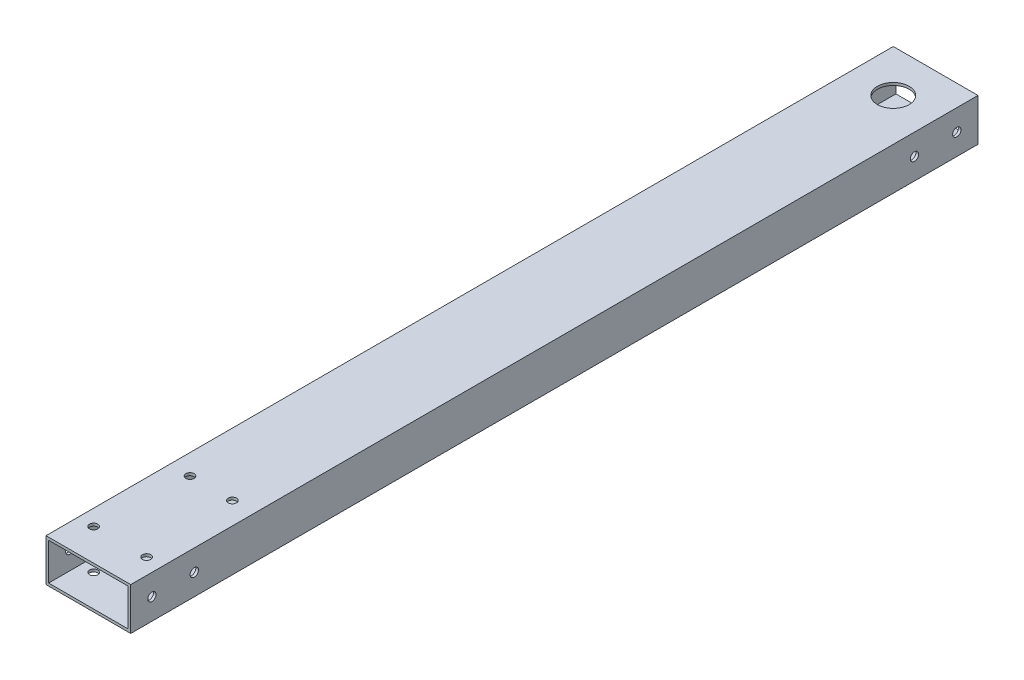
ISO-10303-21;
HEADER;
FILE_DESCRIPTION(('STEP AP214'),'2;1');
FILE_NAME('part.step','',(''),(''),'','','');
FILE_SCHEMA(('AUTOMOTIVE_DESIGN { 1 0 10303 214 1 1 1 1 }'));
ENDSEC;
DATA;
#1=APPLICATION_CONTEXT('core data for automotive mechanical design processes');
#2=APPLICATION_PROTOCOL_DEFINITION('international standard','automotive_design',2000,#1);
#3=PRODUCT_CONTEXT('',#1,'mechanical');
#4=PRODUCT('Part','Part','',(#3));
#5=PRODUCT_RELATED_PRODUCT_CATEGORY('part','',(#4));
#6=PRODUCT_DEFINITION_FORMATION('','',#4);
#7=PRODUCT_DEFINITION_CONTEXT('part definition',#1,'design');
#8=PRODUCT_DEFINITION('design','',#6,#7);
#9=PRODUCT_DEFINITION_SHAPE('','',#8);
#10=(LENGTH_UNIT() NAMED_UNIT(*) SI_UNIT(.MILLI.,.METRE.));
#11=(NAMED_UNIT(*) PLANE_ANGLE_UNIT() SI_UNIT($,.RADIAN.));
#12=(NAMED_UNIT(*) SI_UNIT($,.STERADIAN.) SOLID_ANGLE_UNIT());
#13=UNCERTAINTY_MEASURE_WITH_UNIT(LENGTH_MEASURE(1.E-05),#10,'distance_accuracy_value','');
#14=(GEOMETRIC_REPRESENTATION_CONTEXT(3) GLOBAL_UNCERTAINTY_ASSIGNED_CONTEXT((#13)) GLOBAL_UNIT_ASSIGNED_CONTEXT((#10,
#11,#12)) REPRESENTATION_CONTEXT('',''));
#15=CARTESIAN_POINT('',(0.,0.,0.));
#16=DIRECTION('',(0.,0.,1.));
#17=DIRECTION('',(1.,0.,0.));
#18=AXIS2_PLACEMENT_3D('',#15,#16,#17);
#19=CARTESIAN_POINT('',(0.,0.,254.000000508));
#20=DIRECTION('',(0.,0.,1.));
#21=DIRECTION('',(1.,0.,0.));
#22=AXIS2_PLACEMENT_3D('',#19,#20,#21);
#23=PLANE('',#22);
#24=DIRECTION('',(0.,-1.,0.));
#25=VECTOR('',#24,1.);
#26=CARTESIAN_POINT('',(-25.4,12.7,254.000000508));
#27=LINE('',#26,#25);
#28=CARTESIAN_POINT('',(-25.4,12.7,254.000000508));
#29=VERTEX_POINT('',#28);
#30=CARTESIAN_POINT('',(-25.4,-12.7,254.000000508));
#31=VERTEX_POINT('',#30);
#32=EDGE_CURVE('E123',#29,#31,#27,.T.);
#33=ORIENTED_EDGE('',*,*,#32,.T.);
#34=DIRECTION('',(1.,0.,0.));
#35=VECTOR('',#34,1.);
#36=CARTESIAN_POINT('',(-25.4,-12.7,254.000000508));
#37=LINE('',#36,#35);
#38=CARTESIAN_POINT('',(25.4,-12.7,254.000000508));
#39=VERTEX_POINT('',#38);
#40=EDGE_CURVE('E188',#31,#39,#37,.T.);
#41=ORIENTED_EDGE('',*,*,#40,.T.);
#42=DIRECTION('',(0.,1.,0.));
#43=VECTOR('',#42,1.);
#44=CARTESIAN_POINT('',(25.4,-12.7,254.000000508));
#45=LINE('',#44,#43);
#46=CARTESIAN_POINT('',(25.4,12.7,254.000000508));
#47=VERTEX_POINT('',#46);
#48=EDGE_CURVE('E191',#39,#47,#45,.T.);
#49=ORIENTED_EDGE('',*,*,#48,.T.);
#50=DIRECTION('',(-1.,0.,0.));
#51=VECTOR('',#50,1.);
#52=CARTESIAN_POINT('',(25.4,12.7,254.000000508));
#53=LINE('',#52,#51);
#54=EDGE_CURVE('E69',#47,#29,#53,.T.);
#55=ORIENTED_EDGE('',*,*,#54,.T.);
#56=EDGE_LOOP('',(#33,#41,#49,#55));
#57=FACE_BOUND('',#56,.T.);
#58=DIRECTION('',(1.,0.,0.));
#59=VECTOR('',#58,1.);
#60=CARTESIAN_POINT('',(-23.8125,-11.1125,254.000000508));
#61=LINE('',#60,#59);
#62=CARTESIAN_POINT('',(-23.8125,-11.1125,254.000000508));
#63=VERTEX_POINT('',#62);
#64=CARTESIAN_POINT('',(23.8125,-11.1125,254.000000508));
#65=VERTEX_POINT('',#64);
#66=EDGE_CURVE('E170',#63,#65,#61,.T.);
#67=ORIENTED_EDGE('',*,*,#66,.F.);
#68=DIRECTION('',(0.,-1.,0.));
#69=VECTOR('',#68,1.);
#70=CARTESIAN_POINT('',(-23.8125,11.1125,254.000000508));
#71=LINE('',#70,#69);
#72=CARTESIAN_POINT('',(-23.8125,11.1125,254.000000508));
#73=VERTEX_POINT('',#72);
#74=EDGE_CURVE('E119',#73,#63,#71,.T.);
#75=ORIENTED_EDGE('',*,*,#74,.F.);
#76=DIRECTION('',(-1.,0.,0.));
#77=VECTOR('',#76,1.);
#78=CARTESIAN_POINT('',(23.8125,11.1125,254.000000508));
#79=LINE('',#78,#77);
#80=CARTESIAN_POINT('',(23.8125,11.1125,254.000000508));
#81=VERTEX_POINT('',#80);
#82=EDGE_CURVE('E176',#81,#73,#79,.T.);
#83=ORIENTED_EDGE('',*,*,#82,.F.);
#84=DIRECTION('',(0.,1.,0.));
#85=VECTOR('',#84,1.);
#86=CARTESIAN_POINT('',(23.8125,-11.1125,254.000000508));
#87=LINE('',#86,#85);
#88=EDGE_CURVE('E173',#65,#81,#87,.T.);
#89=ORIENTED_EDGE('',*,*,#88,.F.);
#90=EDGE_LOOP('',(#67,#75,#83,#89));
#91=FACE_BOUND('',#90,.T.);
#92=ADVANCED_FACE('F43',(#57,#91),#23,.T.);
#93=CARTESIAN_POINT('',(-25.4,12.7,254.000000508));
#94=DIRECTION('',(1.,0.,0.));
#95=DIRECTION('',(0.,0.,-1.));
#96=AXIS2_PLACEMENT_3D('',#93,#94,#95);
#97=PLANE('',#96);
#98=CARTESIAN_POINT('',(-25.4,1.33226762955019E-12,241.300000508));
#99=DIRECTION('',(1.,0.,0.));
#100=DIRECTION('',(0.,0.,-1.));
#101=AXIS2_PLACEMENT_3D('',#98,#99,#100);
#102=CIRCLE('',#101,2.48919999999999);
#103=CARTESIAN_POINT('',(-25.4,1.33226762955019E-12,238.810800508));
#104=VERTEX_POINT('',#103);
#105=EDGE_CURVE('E287',#104,#104,#102,.T.);
#106=ORIENTED_EDGE('',*,*,#105,.T.);
#107=EDGE_LOOP('',(#106));
#108=FACE_BOUND('',#107,.T.);
#109=CARTESIAN_POINT('',(-25.4,1.33226762955019E-12,215.900000508));
#110=DIRECTION('',(1.,0.,0.));
#111=DIRECTION('',(0.,0.,-1.));
#112=AXIS2_PLACEMENT_3D('',#109,#110,#111);
#113=CIRCLE('',#112,2.48919999999999);
#114=CARTESIAN_POINT('',(-25.4,1.33226762955019E-12,213.410800508));
#115=VERTEX_POINT('',#114);
#116=EDGE_CURVE('E303',#115,#115,#113,.T.);
#117=ORIENTED_EDGE('',*,*,#116,.T.);
#118=EDGE_LOOP('',(#117));
#119=FACE_BOUND('',#118,.T.);
#120=CARTESIAN_POINT('',(-25.4,1.11022302462516E-13,-215.899999492001));
#121=DIRECTION('',(1.,0.,0.));
#122=DIRECTION('',(0.,0.,-1.));
#123=AXIS2_PLACEMENT_3D('',#120,#121,#122);
#124=CIRCLE('',#123,2.48919999999999);
#125=CARTESIAN_POINT('',(-25.4,1.11022302462516E-13,-218.389199492001));
#126=VERTEX_POINT('',#125);
#127=EDGE_CURVE('E213',#126,#126,#124,.T.);
#128=ORIENTED_EDGE('',*,*,#127,.T.);
#129=EDGE_LOOP('',(#128));
#130=FACE_BOUND('',#129,.T.);
#131=CARTESIAN_POINT('',(-25.4,1.11022302462516E-13,-241.299999492001));
#132=DIRECTION('',(1.,0.,0.));
#133=DIRECTION('',(0.,0.,-1.));
#134=AXIS2_PLACEMENT_3D('',#131,#132,#133);
#135=CIRCLE('',#134,2.48919999999999);
#136=CARTESIAN_POINT('',(-25.4,1.11022302462516E-13,-243.789199492001));
#137=VERTEX_POINT('',#136);
#138=EDGE_CURVE('E207',#137,#137,#135,.T.);
#139=ORIENTED_EDGE('',*,*,#138,.T.);
#140=EDGE_LOOP('',(#139));
#141=FACE_BOUND('',#140,.T.);
#142=DIRECTION('',(0.,0.,-1.));
#143=VECTOR('',#142,1.);
#144=CARTESIAN_POINT('',(-25.4,12.7,254.000000508));
#145=LINE('',#144,#143);
#146=CARTESIAN_POINT('',(-25.4,12.7,-254.000000508));
#147=VERTEX_POINT('',#146);
#148=EDGE_CURVE('E196',#29,#147,#145,.T.);
#149=ORIENTED_EDGE('',*,*,#148,.T.);
#150=DIRECTION('',(0.,-1.,0.));
#151=VECTOR('',#150,1.);
#152=CARTESIAN_POINT('',(-25.4,12.7,-254.000000508));
#153=LINE('',#152,#151);
#154=CARTESIAN_POINT('',(-25.4,-12.7,-254.000000508));
#155=VERTEX_POINT('',#154);
#156=EDGE_CURVE('E152',#147,#155,#153,.T.);
#157=ORIENTED_EDGE('',*,*,#156,.T.);
#158=DIRECTION('',(0.,0.,-1.));
#159=VECTOR('',#158,1.);
#160=CARTESIAN_POINT('',(-25.4,-12.7,254.000000508));
#161=LINE('',#160,#159);
#162=EDGE_CURVE('E11',#31,#155,#161,.T.);
#163=ORIENTED_EDGE('',*,*,#162,.F.);
#164=ORIENTED_EDGE('',*,*,#32,.F.);
#165=EDGE_LOOP('',(#149,#157,#163,#164));
#166=FACE_BOUND('',#165,.T.);
#167=ADVANCED_FACE('F45',(#108,#119,#130,#141,#166),#97,.F.);
#168=CARTESIAN_POINT('',(-25.4,-12.7,254.000000508));
#169=DIRECTION('',(0.,1.,0.));
#170=DIRECTION('',(-1.,0.,0.));
#171=AXIS2_PLACEMENT_3D('',#168,#169,#170);
#172=PLANE('',#171);
#173=CARTESIAN_POINT('',(0.,-12.7,-228.600000508));
#174=DIRECTION('',(0.,1.,0.));
#175=DIRECTION('',(-1.,0.,0.));
#176=AXIS2_PLACEMENT_3D('',#173,#174,#175);
#177=CIRCLE('',#176,9.525);
#178=CARTESIAN_POINT('',(-9.52499999999999,-12.7,-228.600000508));
#179=VERTEX_POINT('',#178);
#180=EDGE_CURVE('E372',#179,#179,#177,.T.);
#181=ORIENTED_EDGE('',*,*,#180,.T.);
#182=EDGE_LOOP('',(#181));
#183=FACE_BOUND('',#182,.T.);
#184=CARTESIAN_POINT('',(-13.2079999089587,-12.7,179.867533038203));
#185=DIRECTION('',(0.,1.,0.));
#186=DIRECTION('',(0.,0.,1.));
#187=AXIS2_PLACEMENT_3D('',#184,#185,#186);
#188=CIRCLE('',#187,2.48919999999999);
#189=CARTESIAN_POINT('',(-13.2079999089587,-12.7,182.356733038203));
#190=VERTEX_POINT('',#189);
#191=EDGE_CURVE('E229',#190,#190,#188,.T.);
#192=ORIENTED_EDGE('',*,*,#191,.T.);
#193=EDGE_LOOP('',(#192));
#194=FACE_BOUND('',#193,.T.);
#195=CARTESIAN_POINT('',(12.1920000910412,-12.7,179.867533038203));
#196=DIRECTION('',(0.,1.,0.));
#197=DIRECTION('',(0.,0.,1.));
#198=AXIS2_PLACEMENT_3D('',#195,#196,#197);
#199=CIRCLE('',#198,2.48919999999999);
#200=CARTESIAN_POINT('',(12.1920000910412,-12.7,182.356733038203));
#201=VERTEX_POINT('',#200);
#202=EDGE_CURVE('E224',#201,#201,#199,.T.);
#203=ORIENTED_EDGE('',*,*,#202,.T.);
#204=EDGE_LOOP('',(#203));
#205=FACE_BOUND('',#204,.T.);
#206=CARTESIAN_POINT('',(-15.875,-12.7,234.950000508));
#207=DIRECTION('',(0.,1.,0.));
#208=DIRECTION('',(0.,0.,1.));
#209=AXIS2_PLACEMENT_3D('',#206,#207,#208);
#210=CIRCLE('',#209,2.48919999999999);
#211=CARTESIAN_POINT('',(-15.875,-12.7,237.439200508));
#212=VERTEX_POINT('',#211);
#213=EDGE_CURVE('E219',#212,#212,#210,.T.);
#214=ORIENTED_EDGE('',*,*,#213,.T.);
#215=EDGE_LOOP('',(#214));
#216=FACE_BOUND('',#215,.T.);
#217=CARTESIAN_POINT('',(15.875,-12.7,234.950000508));
#218=DIRECTION('',(0.,1.,0.));
#219=DIRECTION('',(0.,0.,1.));
#220=AXIS2_PLACEMENT_3D('',#217,#218,#219);
#221=CIRCLE('',#220,2.48919999999999);
#222=CARTESIAN_POINT('',(15.875,-12.7,237.439200508));
#223=VERTEX_POINT('',#222);
#224=EDGE_CURVE('E271',#223,#223,#221,.T.);
#225=ORIENTED_EDGE('',*,*,#224,.T.);
#226=EDGE_LOOP('',(#225));
#227=FACE_BOUND('',#226,.T.);
#228=ORIENTED_EDGE('',*,*,#162,.T.);
#229=DIRECTION('',(1.,0.,0.));
#230=VECTOR('',#229,1.);
#231=CARTESIAN_POINT('',(-25.4,-12.7,-254.000000508));
#232=LINE('',#231,#230);
#233=CARTESIAN_POINT('',(25.4,-12.7,-254.000000508));
#234=VERTEX_POINT('',#233);
#235=EDGE_CURVE('E156',#155,#234,#232,.T.);
#236=ORIENTED_EDGE('',*,*,#235,.T.);
#237=DIRECTION('',(0.,0.,-1.));
#238=VECTOR('',#237,1.);
#239=CARTESIAN_POINT('',(25.4,-12.7,254.000000508));
#240=LINE('',#239,#238);
#241=EDGE_CURVE('E53',#39,#234,#240,.T.);
#242=ORIENTED_EDGE('',*,*,#241,.F.);
#243=ORIENTED_EDGE('',*,*,#40,.F.);
#244=EDGE_LOOP('',(#228,#236,#242,#243));
#245=FACE_BOUND('',#244,.T.);
#246=ADVANCED_FACE('F353',(#183,#194,#205,#216,#227,#245),#172,.F.);
#247=CARTESIAN_POINT('',(25.4,-12.7,254.000000508));
#248=DIRECTION('',(-1.,0.,0.));
#249=DIRECTION('',(0.,0.,1.));
#250=AXIS2_PLACEMENT_3D('',#247,#248,#249);
#251=PLANE('',#250);
#252=CARTESIAN_POINT('',(25.4,1.33226762955019E-12,241.300000508));
#253=DIRECTION('',(1.,0.,0.));
#254=DIRECTION('',(0.,0.,-1.));
#255=AXIS2_PLACEMENT_3D('',#252,#253,#254);
#256=CIRCLE('',#255,2.48919999999999);
#257=CARTESIAN_POINT('',(25.4,1.33226762955019E-12,238.810800508));
#258=VERTEX_POINT('',#257);
#259=EDGE_CURVE('E283',#258,#258,#256,.T.);
#260=ORIENTED_EDGE('',*,*,#259,.F.);
#261=EDGE_LOOP('',(#260));
#262=FACE_BOUND('',#261,.T.);
#263=CARTESIAN_POINT('',(25.4,1.33226762955019E-12,215.900000508));
#264=DIRECTION('',(1.,0.,0.));
#265=DIRECTION('',(0.,0.,-1.));
#266=AXIS2_PLACEMENT_3D('',#263,#264,#265);
#267=CIRCLE('',#266,2.48919999999999);
#268=CARTESIAN_POINT('',(25.4,1.33226762955019E-12,213.410800508));
#269=VERTEX_POINT('',#268);
#270=EDGE_CURVE('E299',#269,#269,#267,.T.);
#271=ORIENTED_EDGE('',*,*,#270,.F.);
#272=EDGE_LOOP('',(#271));
#273=FACE_BOUND('',#272,.T.);
#274=CARTESIAN_POINT('',(25.4,1.11022302462516E-13,-215.899999492001));
#275=DIRECTION('',(1.,0.,0.));
#276=DIRECTION('',(0.,0.,-1.));
#277=AXIS2_PLACEMENT_3D('',#274,#275,#276);
#278=CIRCLE('',#277,2.48919999999999);
#279=CARTESIAN_POINT('',(25.4,1.11022302462516E-13,-218.389199492001));
#280=VERTEX_POINT('',#279);
#281=EDGE_CURVE('E315',#280,#280,#278,.T.);
#282=ORIENTED_EDGE('',*,*,#281,.F.);
#283=EDGE_LOOP('',(#282));
#284=FACE_BOUND('',#283,.T.);
#285=CARTESIAN_POINT('',(25.4,1.11022302462516E-13,-241.299999492001));
#286=DIRECTION('',(1.,0.,0.));
#287=DIRECTION('',(0.,0.,-1.));
#288=AXIS2_PLACEMENT_3D('',#285,#286,#287);
#289=CIRCLE('',#288,2.48919999999999);
#290=CARTESIAN_POINT('',(25.4,1.11022302462516E-13,-243.789199492001));
#291=VERTEX_POINT('',#290);
#292=EDGE_CURVE('E325',#291,#291,#289,.T.);
#293=ORIENTED_EDGE('',*,*,#292,.F.);
#294=EDGE_LOOP('',(#293));
#295=FACE_BOUND('',#294,.T.);
#296=ORIENTED_EDGE('',*,*,#241,.T.);
#297=DIRECTION('',(0.,1.,0.));
#298=VECTOR('',#297,1.);
#299=CARTESIAN_POINT('',(25.4,-12.7,-254.000000508));
#300=LINE('',#299,#298);
#301=CARTESIAN_POINT('',(25.4,12.7,-254.000000508));
#302=VERTEX_POINT('',#301);
#303=EDGE_CURVE('E160',#234,#302,#300,.T.);
#304=ORIENTED_EDGE('',*,*,#303,.T.);
#305=DIRECTION('',(0.,0.,-1.));
#306=VECTOR('',#305,1.);
#307=CARTESIAN_POINT('',(25.4,12.7,254.000000508));
#308=LINE('',#307,#306);
#309=EDGE_CURVE('E199',#47,#302,#308,.T.);
#310=ORIENTED_EDGE('',*,*,#309,.F.);
#311=ORIENTED_EDGE('',*,*,#48,.F.);
#312=EDGE_LOOP('',(#296,#304,#310,#311));
#313=FACE_BOUND('',#312,.T.);
#314=ADVANCED_FACE('F362',(#262,#273,#284,#295,#313),#251,.F.);
#315=CARTESIAN_POINT('',(25.4,12.7,254.000000508));
#316=DIRECTION('',(0.,-1.,0.));
#317=DIRECTION('',(1.,0.,0.));
#318=AXIS2_PLACEMENT_3D('',#315,#316,#317);
#319=PLANE('',#318);
#320=CARTESIAN_POINT('',(0.,12.7,-228.600000508));
#321=DIRECTION('',(0.,1.,0.));
#322=DIRECTION('',(-1.,0.,0.));
#323=AXIS2_PLACEMENT_3D('',#320,#321,#322);
#324=CIRCLE('',#323,9.525);
#325=CARTESIAN_POINT('',(-9.52499999999999,12.7,-228.600000508));
#326=VERTEX_POINT('',#325);
#327=EDGE_CURVE('E497',#326,#326,#324,.T.);
#328=ORIENTED_EDGE('',*,*,#327,.F.);
#329=EDGE_LOOP('',(#328));
#330=FACE_BOUND('',#329,.T.);
#331=CARTESIAN_POINT('',(-13.2079999089587,12.7,179.867533038203));
#332=DIRECTION('',(0.,1.,0.));
#333=DIRECTION('',(0.,0.,1.));
#334=AXIS2_PLACEMENT_3D('',#331,#332,#333);
#335=CIRCLE('',#334,2.48919999999999);
#336=CARTESIAN_POINT('',(-13.2079999089587,12.7,182.356733038203));
#337=VERTEX_POINT('',#336);
#338=EDGE_CURVE('E238',#337,#337,#335,.T.);
#339=ORIENTED_EDGE('',*,*,#338,.F.);
#340=EDGE_LOOP('',(#339));
#341=FACE_BOUND('',#340,.T.);
#342=CARTESIAN_POINT('',(12.1920000910412,12.7,179.867533038203));
#343=DIRECTION('',(0.,1.,0.));
#344=DIRECTION('',(0.,0.,1.));
#345=AXIS2_PLACEMENT_3D('',#342,#343,#344);
#346=CIRCLE('',#345,2.48919999999999);
#347=CARTESIAN_POINT('',(12.1920000910412,12.7,182.356733038203));
#348=VERTEX_POINT('',#347);
#349=EDGE_CURVE('E235',#348,#348,#346,.T.);
#350=ORIENTED_EDGE('',*,*,#349,.F.);
#351=EDGE_LOOP('',(#350));
#352=FACE_BOUND('',#351,.T.);
#353=CARTESIAN_POINT('',(-15.875,12.7,234.950000508));
#354=DIRECTION('',(0.,1.,0.));
#355=DIRECTION('',(0.,0.,1.));
#356=AXIS2_PLACEMENT_3D('',#353,#354,#355);
#357=CIRCLE('',#356,2.48919999999999);
#358=CARTESIAN_POINT('',(-15.875,12.7,237.439200508));
#359=VERTEX_POINT('',#358);
#360=EDGE_CURVE('E257',#359,#359,#357,.T.);
#361=ORIENTED_EDGE('',*,*,#360,.F.);
#362=EDGE_LOOP('',(#361));
#363=FACE_BOUND('',#362,.T.);
#364=CARTESIAN_POINT('',(15.875,12.7,234.950000508));
#365=DIRECTION('',(0.,1.,0.));
#366=DIRECTION('',(0.,0.,1.));
#367=AXIS2_PLACEMENT_3D('',#364,#365,#366);
#368=CIRCLE('',#367,2.48919999999999);
#369=CARTESIAN_POINT('',(15.875,12.7,237.439200508));
#370=VERTEX_POINT('',#369);
#371=EDGE_CURVE('E267',#370,#370,#368,.T.);
#372=ORIENTED_EDGE('',*,*,#371,.F.);
#373=EDGE_LOOP('',(#372));
#374=FACE_BOUND('',#373,.T.);
#375=ORIENTED_EDGE('',*,*,#309,.T.);
#376=DIRECTION('',(-1.,0.,0.));
#377=VECTOR('',#376,1.);
#378=CARTESIAN_POINT('',(25.4,12.7,-254.000000508));
#379=LINE('',#378,#377);
#380=EDGE_CURVE('E164',#302,#147,#379,.T.);
#381=ORIENTED_EDGE('',*,*,#380,.T.);
#382=ORIENTED_EDGE('',*,*,#148,.F.);
#383=ORIENTED_EDGE('',*,*,#54,.F.);
#384=EDGE_LOOP('',(#375,#381,#382,#383));
#385=FACE_BOUND('',#384,.T.);
#386=ADVANCED_FACE('F359',(#330,#341,#352,#363,#374,#385),#319,.F.);
#387=CARTESIAN_POINT('',(-23.8125,11.1125,254.000000508));
#388=DIRECTION('',(1.,0.,0.));
#389=DIRECTION('',(0.,1.,0.));
#390=AXIS2_PLACEMENT_3D('',#387,#388,#389);
#391=PLANE('',#390);
#392=CARTESIAN_POINT('',(-23.8125,1.33226762955019E-12,241.300000508));
#393=DIRECTION('',(1.,0.,0.));
#394=DIRECTION('',(0.,1.,0.));
#395=AXIS2_PLACEMENT_3D('',#392,#393,#394);
#396=CIRCLE('',#395,2.48919999999999);
#397=CARTESIAN_POINT('',(-23.8125,2.48920000000132,241.300000508));
#398=VERTEX_POINT('',#397);
#399=EDGE_CURVE('E295',#398,#398,#396,.T.);
#400=ORIENTED_EDGE('',*,*,#399,.F.);
#401=EDGE_LOOP('',(#400));
#402=FACE_BOUND('',#401,.T.);
#403=CARTESIAN_POINT('',(-23.8125,1.33226762955019E-12,215.900000508));
#404=DIRECTION('',(1.,0.,0.));
#405=DIRECTION('',(0.,1.,0.));
#406=AXIS2_PLACEMENT_3D('',#403,#404,#405);
#407=CIRCLE('',#406,2.48919999999999);
#408=CARTESIAN_POINT('',(-23.8125,2.48920000000132,215.900000508));
#409=VERTEX_POINT('',#408);
#410=EDGE_CURVE('E311',#409,#409,#407,.T.);
#411=ORIENTED_EDGE('',*,*,#410,.F.);
#412=EDGE_LOOP('',(#411));
#413=FACE_BOUND('',#412,.T.);
#414=CARTESIAN_POINT('',(-23.8125,1.11022302462516E-13,-215.899999492001));
#415=DIRECTION('',(1.,0.,0.));
#416=DIRECTION('',(0.,1.,0.));
#417=AXIS2_PLACEMENT_3D('',#414,#415,#416);
#418=CIRCLE('',#417,2.48919999999999);
#419=CARTESIAN_POINT('',(-23.8125,2.4892000000001,-215.899999492001));
#420=VERTEX_POINT('',#419);
#421=EDGE_CURVE('E212',#420,#420,#418,.T.);
#422=ORIENTED_EDGE('',*,*,#421,.F.);
#423=EDGE_LOOP('',(#422));
#424=FACE_BOUND('',#423,.T.);
#425=CARTESIAN_POINT('',(-23.8125,1.11022302462516E-13,-241.299999492001));
#426=DIRECTION('',(1.,0.,0.));
#427=DIRECTION('',(0.,1.,0.));
#428=AXIS2_PLACEMENT_3D('',#425,#426,#427);
#429=CIRCLE('',#428,2.48919999999999);
#430=CARTESIAN_POINT('',(-23.8125,2.4892000000001,-241.299999492001));
#431=VERTEX_POINT('',#430);
#432=EDGE_CURVE('E144',#431,#431,#429,.T.);
#433=ORIENTED_EDGE('',*,*,#432,.F.);
#434=EDGE_LOOP('',(#433));
#435=FACE_BOUND('',#434,.T.);
#436=DIRECTION('',(0.,0.,-1.));
#437=VECTOR('',#436,1.);
#438=CARTESIAN_POINT('',(-23.8125,-11.1125,254.000000508));
#439=LINE('',#438,#437);
#440=CARTESIAN_POINT('',(-23.8125,-11.1125,-254.000000508));
#441=VERTEX_POINT('',#440);
#442=EDGE_CURVE('E111',#63,#441,#439,.T.);
#443=ORIENTED_EDGE('',*,*,#442,.T.);
#444=DIRECTION('',(0.,-1.,0.));
#445=VECTOR('',#444,1.);
#446=CARTESIAN_POINT('',(-23.8125,11.1125,-254.000000508));
#447=LINE('',#446,#445);
#448=CARTESIAN_POINT('',(-23.8125,11.1125,-254.000000508));
#449=VERTEX_POINT('',#448);
#450=EDGE_CURVE('E116',#449,#441,#447,.T.);
#451=ORIENTED_EDGE('',*,*,#450,.F.);
#452=DIRECTION('',(0.,0.,-1.));
#453=VECTOR('',#452,1.);
#454=CARTESIAN_POINT('',(-23.8125,11.1125,254.000000508));
#455=LINE('',#454,#453);
#456=EDGE_CURVE('E179',#73,#449,#455,.T.);
#457=ORIENTED_EDGE('',*,*,#456,.F.);
#458=ORIENTED_EDGE('',*,*,#74,.T.);
#459=EDGE_LOOP('',(#443,#451,#457,#458));
#460=FACE_BOUND('',#459,.T.);
#461=ADVANCED_FACE('F113',(#402,#413,#424,#435,#460),#391,.T.);
#462=CARTESIAN_POINT('',(-23.8125,-11.1125,254.000000508));
#463=DIRECTION('',(0.,1.,0.));
#464=DIRECTION('',(0.,0.,1.));
#465=AXIS2_PLACEMENT_3D('',#462,#463,#464);
#466=PLANE('',#465);
#467=CARTESIAN_POINT('',(0.,-11.1125,-228.600000508));
#468=DIRECTION('',(0.,1.,0.));
#469=DIRECTION('',(0.,0.,1.));
#470=AXIS2_PLACEMENT_3D('',#467,#468,#469);
#471=CIRCLE('',#470,9.525);
#472=CARTESIAN_POINT('',(0.,-11.1125,-219.075000508));
#473=VERTEX_POINT('',#472);
#474=EDGE_CURVE('E244',#473,#473,#471,.T.);
#475=ORIENTED_EDGE('',*,*,#474,.F.);
#476=EDGE_LOOP('',(#475));
#477=FACE_BOUND('',#476,.T.);
#478=CARTESIAN_POINT('',(-13.2079999089587,-11.1125,179.867533038203));
#479=DIRECTION('',(0.,1.,0.));
#480=DIRECTION('',(0.,0.,1.));
#481=AXIS2_PLACEMENT_3D('',#478,#479,#480);
#482=CIRCLE('',#481,2.48919999999999);
#483=CARTESIAN_POINT('',(-13.2079999089587,-11.1125,182.356733038203));
#484=VERTEX_POINT('',#483);
#485=EDGE_CURVE('E228',#484,#484,#482,.T.);
#486=ORIENTED_EDGE('',*,*,#485,.F.);
#487=EDGE_LOOP('',(#486));
#488=FACE_BOUND('',#487,.T.);
#489=CARTESIAN_POINT('',(12.1920000910412,-11.1125,179.867533038203));
#490=DIRECTION('',(0.,1.,0.));
#491=DIRECTION('',(0.,0.,1.));
#492=AXIS2_PLACEMENT_3D('',#489,#490,#491);
#493=CIRCLE('',#492,2.48919999999999);
#494=CARTESIAN_POINT('',(12.1920000910412,-11.1125,182.356733038203));
#495=VERTEX_POINT('',#494);
#496=EDGE_CURVE('E223',#495,#495,#493,.T.);
#497=ORIENTED_EDGE('',*,*,#496,.F.);
#498=EDGE_LOOP('',(#497));
#499=FACE_BOUND('',#498,.T.);
#500=CARTESIAN_POINT('',(-15.875,-11.1125,234.950000508));
#501=DIRECTION('',(0.,1.,0.));
#502=DIRECTION('',(0.,0.,1.));
#503=AXIS2_PLACEMENT_3D('',#500,#501,#502);
#504=CIRCLE('',#503,2.48919999999999);
#505=CARTESIAN_POINT('',(-15.875,-11.1125,237.439200508));
#506=VERTEX_POINT('',#505);
#507=EDGE_CURVE('E218',#506,#506,#504,.T.);
#508=ORIENTED_EDGE('',*,*,#507,.F.);
#509=EDGE_LOOP('',(#508));
#510=FACE_BOUND('',#509,.T.);
#511=CARTESIAN_POINT('',(15.875,-11.1125,234.950000508));
#512=DIRECTION('',(0.,1.,0.));
#513=DIRECTION('',(0.,0.,1.));
#514=AXIS2_PLACEMENT_3D('',#511,#512,#513);
#515=CIRCLE('',#514,2.48919999999999);
#516=CARTESIAN_POINT('',(15.875,-11.1125,237.439200508));
#517=VERTEX_POINT('',#516);
#518=EDGE_CURVE('E279',#517,#517,#515,.T.);
#519=ORIENTED_EDGE('',*,*,#518,.F.);
#520=EDGE_LOOP('',(#519));
#521=FACE_BOUND('',#520,.T.);
#522=DIRECTION('',(0.,0.,-1.));
#523=VECTOR('',#522,1.);
#524=CARTESIAN_POINT('',(23.8125,-11.1125,254.000000508));
#525=LINE('',#524,#523);
#526=CARTESIAN_POINT('',(23.8125,-11.1125,-254.000000508));
#527=VERTEX_POINT('',#526);
#528=EDGE_CURVE('E124',#65,#527,#525,.T.);
#529=ORIENTED_EDGE('',*,*,#528,.T.);
#530=DIRECTION('',(1.,0.,0.));
#531=VECTOR('',#530,1.);
#532=CARTESIAN_POINT('',(-23.8125,-11.1125,-254.000000508));
#533=LINE('',#532,#531);
#534=EDGE_CURVE('E127',#441,#527,#533,.T.);
#535=ORIENTED_EDGE('',*,*,#534,.F.);
#536=ORIENTED_EDGE('',*,*,#442,.F.);
#537=ORIENTED_EDGE('',*,*,#66,.T.);
#538=EDGE_LOOP('',(#529,#535,#536,#537));
#539=FACE_BOUND('',#538,.T.);
#540=ADVANCED_FACE('F128',(#477,#488,#499,#510,#521,#539),#466,.T.);
#541=CARTESIAN_POINT('',(23.8125,-11.1125,254.000000508));
#542=DIRECTION('',(-1.,0.,0.));
#543=DIRECTION('',(0.,0.,1.));
#544=AXIS2_PLACEMENT_3D('',#541,#542,#543);
#545=PLANE('',#544);
#546=CARTESIAN_POINT('',(23.8125,1.33226762955019E-12,241.300000508));
#547=DIRECTION('',(-1.,0.,0.));
#548=DIRECTION('',(0.,0.,1.));
#549=AXIS2_PLACEMENT_3D('',#546,#547,#548);
#550=CIRCLE('',#549,2.48919999999999);
#551=CARTESIAN_POINT('',(23.8125,1.33226762955019E-12,243.789200508));
#552=VERTEX_POINT('',#551);
#553=EDGE_CURVE('E291',#552,#552,#550,.T.);
#554=ORIENTED_EDGE('',*,*,#553,.F.);
#555=EDGE_LOOP('',(#554));
#556=FACE_BOUND('',#555,.T.);
#557=CARTESIAN_POINT('',(23.8125,1.33226762955019E-12,215.900000508));
#558=DIRECTION('',(-1.,0.,0.));
#559=DIRECTION('',(0.,0.,1.));
#560=AXIS2_PLACEMENT_3D('',#557,#558,#559);
#561=CIRCLE('',#560,2.48919999999999);
#562=CARTESIAN_POINT('',(23.8125,1.33226762955019E-12,218.389200508));
#563=VERTEX_POINT('',#562);
#564=EDGE_CURVE('E307',#563,#563,#561,.T.);
#565=ORIENTED_EDGE('',*,*,#564,.F.);
#566=EDGE_LOOP('',(#565));
#567=FACE_BOUND('',#566,.T.);
#568=CARTESIAN_POINT('',(23.8125,1.11022302462516E-13,-215.899999492001));
#569=DIRECTION('',(-1.,0.,0.));
#570=DIRECTION('',(0.,0.,1.));
#571=AXIS2_PLACEMENT_3D('',#568,#569,#570);
#572=CIRCLE('',#571,2.48919999999999);
#573=CARTESIAN_POINT('',(23.8125,1.11022302462516E-13,-213.410799492001));
#574=VERTEX_POINT('',#573);
#575=EDGE_CURVE('E208',#574,#574,#572,.T.);
#576=ORIENTED_EDGE('',*,*,#575,.F.);
#577=EDGE_LOOP('',(#576));
#578=FACE_BOUND('',#577,.T.);
#579=CARTESIAN_POINT('',(23.8125,1.11022302462516E-13,-241.299999492001));
#580=DIRECTION('',(-1.,0.,0.));
#581=DIRECTION('',(0.,0.,1.));
#582=AXIS2_PLACEMENT_3D('',#579,#580,#581);
#583=CIRCLE('',#582,2.48919999999999);
#584=CARTESIAN_POINT('',(23.8125,1.11022302462516E-13,-238.810799492001));
#585=VERTEX_POINT('',#584);
#586=EDGE_CURVE('E140',#585,#585,#583,.T.);
#587=ORIENTED_EDGE('',*,*,#586,.F.);
#588=EDGE_LOOP('',(#587));
#589=FACE_BOUND('',#588,.T.);
#590=DIRECTION('',(0.,0.,-1.));
#591=VECTOR('',#590,1.);
#592=CARTESIAN_POINT('',(23.8125,11.1125,254.000000508));
#593=LINE('',#592,#591);
#594=CARTESIAN_POINT('',(23.8125,11.1125,-254.000000508));
#595=VERTEX_POINT('',#594);
#596=EDGE_CURVE('E61',#81,#595,#593,.T.);
#597=ORIENTED_EDGE('',*,*,#596,.T.);
#598=DIRECTION('',(0.,1.,0.));
#599=VECTOR('',#598,1.);
#600=CARTESIAN_POINT('',(23.8125,-11.1125,-254.000000508));
#601=LINE('',#600,#599);
#602=EDGE_CURVE('E134',#527,#595,#601,.T.);
#603=ORIENTED_EDGE('',*,*,#602,.F.);
#604=ORIENTED_EDGE('',*,*,#528,.F.);
#605=ORIENTED_EDGE('',*,*,#88,.T.);
#606=EDGE_LOOP('',(#597,#603,#604,#605));
#607=FACE_BOUND('',#606,.T.);
#608=ADVANCED_FACE('F432',(#556,#567,#578,#589,#607),#545,.T.);
#609=CARTESIAN_POINT('',(23.8125,11.1125,254.000000508));
#610=DIRECTION('',(0.,-1.,0.));
#611=DIRECTION('',(0.,0.,-1.));
#612=AXIS2_PLACEMENT_3D('',#609,#610,#611);
#613=PLANE('',#612);
#614=CARTESIAN_POINT('',(0.,11.1125,-228.600000508));
#615=DIRECTION('',(0.,-1.,0.));
#616=DIRECTION('',(0.,0.,-1.));
#617=AXIS2_PLACEMENT_3D('',#614,#615,#616);
#618=CIRCLE('',#617,9.525);
#619=CARTESIAN_POINT('',(0.,11.1125,-238.125000508));
#620=VERTEX_POINT('',#619);
#621=EDGE_CURVE('E47',#620,#620,#618,.T.);
#622=ORIENTED_EDGE('',*,*,#621,.F.);
#623=EDGE_LOOP('',(#622));
#624=FACE_BOUND('',#623,.T.);
#625=CARTESIAN_POINT('',(-13.2079999089587,11.1125,179.867533038203));
#626=DIRECTION('',(0.,-1.,0.));
#627=DIRECTION('',(0.,0.,-1.));
#628=AXIS2_PLACEMENT_3D('',#625,#626,#627);
#629=CIRCLE('',#628,2.48919999999999);
#630=CARTESIAN_POINT('',(-13.2079999089587,11.1125,177.378333038203));
#631=VERTEX_POINT('',#630);
#632=EDGE_CURVE('E225',#631,#631,#629,.T.);
#633=ORIENTED_EDGE('',*,*,#632,.F.);
#634=EDGE_LOOP('',(#633));
#635=FACE_BOUND('',#634,.T.);
#636=CARTESIAN_POINT('',(12.1920000910412,11.1125,179.867533038203));
#637=DIRECTION('',(0.,-1.,0.));
#638=DIRECTION('',(0.,0.,-1.));
#639=AXIS2_PLACEMENT_3D('',#636,#637,#638);
#640=CIRCLE('',#639,2.48919999999999);
#641=CARTESIAN_POINT('',(12.1920000910412,11.1125,177.378333038203));
#642=VERTEX_POINT('',#641);
#643=EDGE_CURVE('E220',#642,#642,#640,.T.);
#644=ORIENTED_EDGE('',*,*,#643,.F.);
#645=EDGE_LOOP('',(#644));
#646=FACE_BOUND('',#645,.T.);
#647=CARTESIAN_POINT('',(-15.875,11.1125,234.950000508));
#648=DIRECTION('',(0.,-1.,0.));
#649=DIRECTION('',(0.,0.,-1.));
#650=AXIS2_PLACEMENT_3D('',#647,#648,#649);
#651=CIRCLE('',#650,2.48919999999999);
#652=CARTESIAN_POINT('',(-15.875,11.1125,232.460800508));
#653=VERTEX_POINT('',#652);
#654=EDGE_CURVE('E214',#653,#653,#651,.T.);
#655=ORIENTED_EDGE('',*,*,#654,.F.);
#656=EDGE_LOOP('',(#655));
#657=FACE_BOUND('',#656,.T.);
#658=CARTESIAN_POINT('',(15.875,11.1125,234.950000508));
#659=DIRECTION('',(0.,-1.,0.));
#660=DIRECTION('',(0.,0.,-1.));
#661=AXIS2_PLACEMENT_3D('',#658,#659,#660);
#662=CIRCLE('',#661,2.48919999999999);
#663=CARTESIAN_POINT('',(15.875,11.1125,232.460800508));
#664=VERTEX_POINT('',#663);
#665=EDGE_CURVE('E275',#664,#664,#662,.T.);
#666=ORIENTED_EDGE('',*,*,#665,.F.);
#667=EDGE_LOOP('',(#666));
#668=FACE_BOUND('',#667,.T.);
#669=ORIENTED_EDGE('',*,*,#456,.T.);
#670=DIRECTION('',(-1.,0.,0.));
#671=VECTOR('',#670,1.);
#672=CARTESIAN_POINT('',(23.8125,11.1125,-254.000000508));
#673=LINE('',#672,#671);
#674=EDGE_CURVE('E138',#595,#449,#673,.T.);
#675=ORIENTED_EDGE('',*,*,#674,.F.);
#676=ORIENTED_EDGE('',*,*,#596,.F.);
#677=ORIENTED_EDGE('',*,*,#82,.T.);
#678=EDGE_LOOP('',(#669,#675,#676,#677));
#679=FACE_BOUND('',#678,.T.);
#680=ADVANCED_FACE('F345',(#624,#635,#646,#657,#668,#679),#613,.T.);
#681=CARTESIAN_POINT('',(0.,0.,-254.000000508));
#682=DIRECTION('',(0.,0.,1.));
#683=DIRECTION('',(1.,0.,0.));
#684=AXIS2_PLACEMENT_3D('',#681,#682,#683);
#685=PLANE('',#684);
#686=ORIENTED_EDGE('',*,*,#674,.T.);
#687=ORIENTED_EDGE('',*,*,#450,.T.);
#688=ORIENTED_EDGE('',*,*,#534,.T.);
#689=ORIENTED_EDGE('',*,*,#602,.T.);
#690=EDGE_LOOP('',(#686,#687,#688,#689));
#691=FACE_BOUND('',#690,.T.);
#692=ORIENTED_EDGE('',*,*,#156,.F.);
#693=ORIENTED_EDGE('',*,*,#380,.F.);
#694=ORIENTED_EDGE('',*,*,#303,.F.);
#695=ORIENTED_EDGE('',*,*,#235,.F.);
#696=EDGE_LOOP('',(#692,#693,#694,#695));
#697=FACE_BOUND('',#696,.T.);
#698=ADVANCED_FACE('F136',(#691,#697),#685,.F.);
#699=CARTESIAN_POINT('',(25.4,1.11022302462516E-13,-241.299999492001));
#700=DIRECTION('',(1.,0.,0.));
#701=DIRECTION('',(0.,0.,-1.));
#702=AXIS2_PLACEMENT_3D('',#699,#700,#701);
#703=CYLINDRICAL_SURFACE('',#702,2.48919999999999);
#704=ORIENTED_EDGE('',*,*,#432,.T.);
#705=EDGE_LOOP('',(#704));
#706=FACE_BOUND('',#705,.T.);
#707=ORIENTED_EDGE('',*,*,#138,.F.);
#708=EDGE_LOOP('',(#707));
#709=FACE_BOUND('',#708,.T.);
#710=ADVANCED_FACE('F334',(#706,#709),#703,.F.);
#711=ORIENTED_EDGE('',*,*,#586,.T.);
#712=EDGE_LOOP('',(#711));
#713=FACE_BOUND('',#712,.T.);
#714=ORIENTED_EDGE('',*,*,#292,.T.);
#715=EDGE_LOOP('',(#714));
#716=FACE_BOUND('',#715,.T.);
#717=ADVANCED_FACE('F336',(#713,#716),#703,.F.);
#718=CARTESIAN_POINT('',(25.4,1.11022302462516E-13,-215.899999492001));
#719=DIRECTION('',(1.,0.,0.));
#720=DIRECTION('',(0.,0.,-1.));
#721=AXIS2_PLACEMENT_3D('',#718,#719,#720);
#722=CYLINDRICAL_SURFACE('',#721,2.48919999999999);
#723=ORIENTED_EDGE('',*,*,#575,.T.);
#724=EDGE_LOOP('',(#723));
#725=FACE_BOUND('',#724,.T.);
#726=ORIENTED_EDGE('',*,*,#281,.T.);
#727=EDGE_LOOP('',(#726));
#728=FACE_BOUND('',#727,.T.);
#729=ADVANCED_FACE('F343',(#725,#728),#722,.F.);
#730=ORIENTED_EDGE('',*,*,#421,.T.);
#731=EDGE_LOOP('',(#730));
#732=FACE_BOUND('',#731,.T.);
#733=ORIENTED_EDGE('',*,*,#127,.F.);
#734=EDGE_LOOP('',(#733));
#735=FACE_BOUND('',#734,.T.);
#736=ADVANCED_FACE('F416',(#732,#735),#722,.F.);
#737=CARTESIAN_POINT('',(25.4,1.33226762955019E-12,215.900000508));
#738=DIRECTION('',(1.,0.,0.));
#739=DIRECTION('',(0.,0.,-1.));
#740=AXIS2_PLACEMENT_3D('',#737,#738,#739);
#741=CYLINDRICAL_SURFACE('',#740,2.48919999999999);
#742=ORIENTED_EDGE('',*,*,#564,.T.);
#743=EDGE_LOOP('',(#742));
#744=FACE_BOUND('',#743,.T.);
#745=ORIENTED_EDGE('',*,*,#270,.T.);
#746=EDGE_LOOP('',(#745));
#747=FACE_BOUND('',#746,.T.);
#748=ADVANCED_FACE('F414',(#744,#747),#741,.F.);
#749=ORIENTED_EDGE('',*,*,#410,.T.);
#750=EDGE_LOOP('',(#749));
#751=FACE_BOUND('',#750,.T.);
#752=ORIENTED_EDGE('',*,*,#116,.F.);
#753=EDGE_LOOP('',(#752));
#754=FACE_BOUND('',#753,.T.);
#755=ADVANCED_FACE('F412',(#751,#754),#741,.F.);
#756=CARTESIAN_POINT('',(25.4,1.33226762955019E-12,241.300000508));
#757=DIRECTION('',(1.,0.,0.));
#758=DIRECTION('',(0.,0.,-1.));
#759=AXIS2_PLACEMENT_3D('',#756,#757,#758);
#760=CYLINDRICAL_SURFACE('',#759,2.48919999999999);
#761=ORIENTED_EDGE('',*,*,#553,.T.);
#762=EDGE_LOOP('',(#761));
#763=FACE_BOUND('',#762,.T.);
#764=ORIENTED_EDGE('',*,*,#259,.T.);
#765=EDGE_LOOP('',(#764));
#766=FACE_BOUND('',#765,.T.);
#767=ADVANCED_FACE('F409',(#763,#766),#760,.F.);
#768=ORIENTED_EDGE('',*,*,#399,.T.);
#769=EDGE_LOOP('',(#768));
#770=FACE_BOUND('',#769,.T.);
#771=ORIENTED_EDGE('',*,*,#105,.F.);
#772=EDGE_LOOP('',(#771));
#773=FACE_BOUND('',#772,.T.);
#774=ADVANCED_FACE('F405',(#770,#773),#760,.F.);
#775=CARTESIAN_POINT('',(15.875,12.7,234.950000508));
#776=DIRECTION('',(0.,1.,0.));
#777=DIRECTION('',(0.,0.,1.));
#778=AXIS2_PLACEMENT_3D('',#775,#776,#777);
#779=CYLINDRICAL_SURFACE('',#778,2.48919999999999);
#780=ORIENTED_EDGE('',*,*,#665,.T.);
#781=EDGE_LOOP('',(#780));
#782=FACE_BOUND('',#781,.T.);
#783=ORIENTED_EDGE('',*,*,#371,.T.);
#784=EDGE_LOOP('',(#783));
#785=FACE_BOUND('',#784,.T.);
#786=ADVANCED_FACE('F395',(#782,#785),#779,.F.);
#787=ORIENTED_EDGE('',*,*,#518,.T.);
#788=EDGE_LOOP('',(#787));
#789=FACE_BOUND('',#788,.T.);
#790=ORIENTED_EDGE('',*,*,#224,.F.);
#791=EDGE_LOOP('',(#790));
#792=FACE_BOUND('',#791,.T.);
#793=ADVANCED_FACE('F392',(#789,#792),#779,.F.);
#794=CARTESIAN_POINT('',(-15.875,12.7,234.950000508));
#795=DIRECTION('',(0.,1.,0.));
#796=DIRECTION('',(0.,0.,1.));
#797=AXIS2_PLACEMENT_3D('',#794,#795,#796);
#798=CYLINDRICAL_SURFACE('',#797,2.48919999999999);
#799=ORIENTED_EDGE('',*,*,#654,.T.);
#800=EDGE_LOOP('',(#799));
#801=FACE_BOUND('',#800,.T.);
#802=ORIENTED_EDGE('',*,*,#360,.T.);
#803=EDGE_LOOP('',(#802));
#804=FACE_BOUND('',#803,.T.);
#805=ADVANCED_FACE('F394',(#801,#804),#798,.F.);
#806=ORIENTED_EDGE('',*,*,#507,.T.);
#807=EDGE_LOOP('',(#806));
#808=FACE_BOUND('',#807,.T.);
#809=ORIENTED_EDGE('',*,*,#213,.F.);
#810=EDGE_LOOP('',(#809));
#811=FACE_BOUND('',#810,.T.);
#812=ADVANCED_FACE('F402',(#808,#811),#798,.F.);
#813=CARTESIAN_POINT('',(12.1920000910412,12.7,179.867533038203));
#814=DIRECTION('',(0.,1.,0.));
#815=DIRECTION('',(0.,0.,1.));
#816=AXIS2_PLACEMENT_3D('',#813,#814,#815);
#817=CYLINDRICAL_SURFACE('',#816,2.48919999999999);
#818=ORIENTED_EDGE('',*,*,#643,.T.);
#819=EDGE_LOOP('',(#818));
#820=FACE_BOUND('',#819,.T.);
#821=ORIENTED_EDGE('',*,*,#349,.T.);
#822=EDGE_LOOP('',(#821));
#823=FACE_BOUND('',#822,.T.);
#824=ADVANCED_FACE('F467',(#820,#823),#817,.F.);
#825=ORIENTED_EDGE('',*,*,#496,.T.);
#826=EDGE_LOOP('',(#825));
#827=FACE_BOUND('',#826,.T.);
#828=ORIENTED_EDGE('',*,*,#202,.F.);
#829=EDGE_LOOP('',(#828));
#830=FACE_BOUND('',#829,.T.);
#831=ADVANCED_FACE('F471',(#827,#830),#817,.F.);
#832=CARTESIAN_POINT('',(-13.2079999089587,12.7,179.867533038203));
#833=DIRECTION('',(0.,1.,0.));
#834=DIRECTION('',(0.,0.,1.));
#835=AXIS2_PLACEMENT_3D('',#832,#833,#834);
#836=CYLINDRICAL_SURFACE('',#835,2.48919999999999);
#837=ORIENTED_EDGE('',*,*,#632,.T.);
#838=EDGE_LOOP('',(#837));
#839=FACE_BOUND('',#838,.T.);
#840=ORIENTED_EDGE('',*,*,#338,.T.);
#841=EDGE_LOOP('',(#840));
#842=FACE_BOUND('',#841,.T.);
#843=ADVANCED_FACE('F476',(#839,#842),#836,.F.);
#844=ORIENTED_EDGE('',*,*,#485,.T.);
#845=EDGE_LOOP('',(#844));
#846=FACE_BOUND('',#845,.T.);
#847=ORIENTED_EDGE('',*,*,#191,.F.);
#848=EDGE_LOOP('',(#847));
#849=FACE_BOUND('',#848,.T.);
#850=ADVANCED_FACE('F482',(#846,#849),#836,.F.);
#851=CARTESIAN_POINT('',(0.,-12.7,-228.600000508));
#852=DIRECTION('',(0.,1.,0.));
#853=DIRECTION('',(-1.,0.,0.));
#854=AXIS2_PLACEMENT_3D('',#851,#852,#853);
#855=CYLINDRICAL_SURFACE('',#854,9.525);
#856=ORIENTED_EDGE('',*,*,#621,.T.);
#857=EDGE_LOOP('',(#856));
#858=FACE_BOUND('',#857,.T.);
#859=ORIENTED_EDGE('',*,*,#327,.T.);
#860=EDGE_LOOP('',(#859));
#861=FACE_BOUND('',#860,.T.);
#862=ADVANCED_FACE('F483',(#858,#861),#855,.F.);
#863=ORIENTED_EDGE('',*,*,#474,.T.);
#864=EDGE_LOOP('',(#863));
#865=FACE_BOUND('',#864,.T.);
#866=ORIENTED_EDGE('',*,*,#180,.F.);
#867=EDGE_LOOP('',(#866));
#868=FACE_BOUND('',#867,.T.);
#869=ADVANCED_FACE('F485',(#865,#868),#855,.F.);
#870=CLOSED_SHELL('',(#92,#167,#246,#314,#386,#461,#540,#608,#680,#698,#710,#717,#729,#736,#748,
#755,#767,#774,#786,#793,#805,#812,#824,#831,#843,#850,#862,#869));
#871=MANIFOLD_SOLID_BREP('B2',#870);
#872=ADVANCED_BREP_SHAPE_REPRESENTATION('',(#18,#871),#14);
#873=SHAPE_DEFINITION_REPRESENTATION(#9,#872);
ENDSEC;
END-ISO-10303-21;
